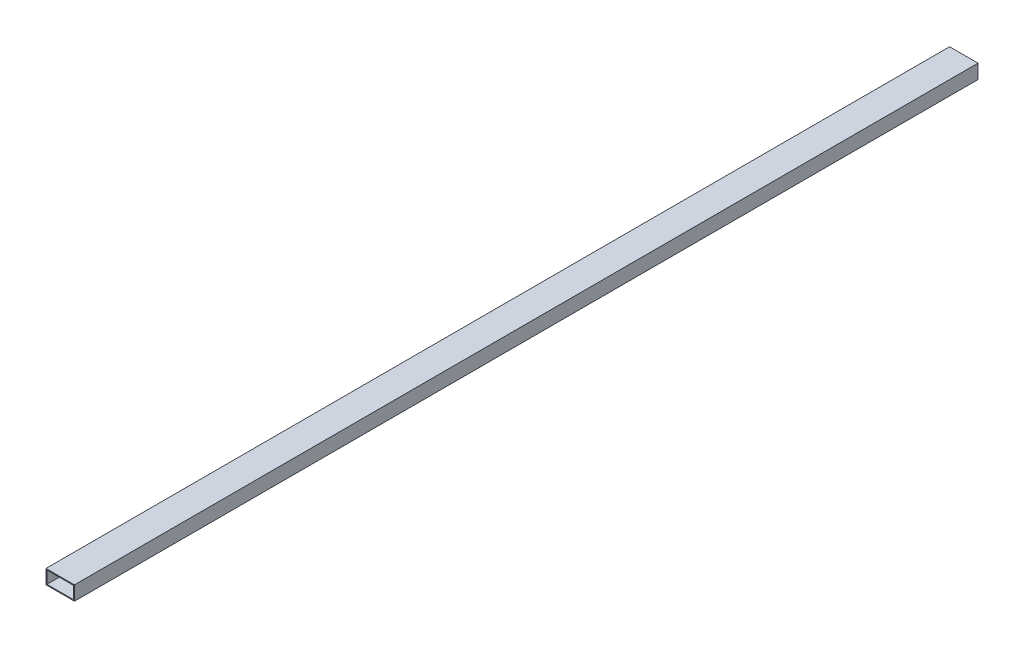
ISO-10303-21;
HEADER;
FILE_DESCRIPTION(('STEP AP214'),'2;1');
FILE_NAME('part.step','',(''),(''),'','','');
FILE_SCHEMA(('AUTOMOTIVE_DESIGN { 1 0 10303 214 1 1 1 1 }'));
ENDSEC;
DATA;
#1=APPLICATION_CONTEXT('core data for automotive mechanical design processes');
#2=APPLICATION_PROTOCOL_DEFINITION('international standard','automotive_design',2000,#1);
#3=PRODUCT_CONTEXT('',#1,'mechanical');
#4=PRODUCT('Part','Part','',(#3));
#5=PRODUCT_RELATED_PRODUCT_CATEGORY('part','',(#4));
#6=PRODUCT_DEFINITION_FORMATION('','',#4);
#7=PRODUCT_DEFINITION_CONTEXT('part definition',#1,'design');
#8=PRODUCT_DEFINITION('design','',#6,#7);
#9=PRODUCT_DEFINITION_SHAPE('','',#8);
#10=(LENGTH_UNIT() NAMED_UNIT(*) SI_UNIT(.MILLI.,.METRE.));
#11=(NAMED_UNIT(*) PLANE_ANGLE_UNIT() SI_UNIT($,.RADIAN.));
#12=(NAMED_UNIT(*) SI_UNIT($,.STERADIAN.) SOLID_ANGLE_UNIT());
#13=UNCERTAINTY_MEASURE_WITH_UNIT(LENGTH_MEASURE(1.E-05),#10,'distance_accuracy_value','');
#14=(GEOMETRIC_REPRESENTATION_CONTEXT(3) GLOBAL_UNCERTAINTY_ASSIGNED_CONTEXT((#13)) GLOBAL_UNIT_ASSIGNED_CONTEXT((#10,
#11,#12)) REPRESENTATION_CONTEXT('',''));
#15=CARTESIAN_POINT('',(0.,0.,0.));
#16=DIRECTION('',(0.,0.,1.));
#17=DIRECTION('',(1.,0.,0.));
#18=AXIS2_PLACEMENT_3D('',#15,#16,#17);
#19=CARTESIAN_POINT('',(0.,0.,953.));
#20=DIRECTION('',(0.,0.,-1.));
#21=DIRECTION('',(-1.,0.,0.));
#22=AXIS2_PLACEMENT_3D('',#19,#20,#21);
#23=PLANE('',#22);
#24=DIRECTION('',(0.,-1.,0.));
#25=VECTOR('',#24,1.);
#26=CARTESIAN_POINT('',(0.,0.,953.));
#27=LINE('',#26,#25);
#28=CARTESIAN_POINT('',(0.,15.,953.));
#29=VERTEX_POINT('',#28);
#30=CARTESIAN_POINT('',(0.,0.,953.));
#31=VERTEX_POINT('',#30);
#32=EDGE_CURVE('E136',#29,#31,#27,.T.);
#33=ORIENTED_EDGE('',*,*,#32,.T.);
#34=DIRECTION('',(1.,0.,0.));
#35=VECTOR('',#34,1.);
#36=CARTESIAN_POINT('',(0.,0.,953.));
#37=LINE('',#36,#35);
#38=CARTESIAN_POINT('',(30.,0.,953.));
#39=VERTEX_POINT('',#38);
#40=EDGE_CURVE('E139',#31,#39,#37,.T.);
#41=ORIENTED_EDGE('',*,*,#40,.T.);
#42=DIRECTION('',(0.,1.,0.));
#43=VECTOR('',#42,1.);
#44=CARTESIAN_POINT('',(30.,0.,953.));
#45=LINE('',#44,#43);
#46=CARTESIAN_POINT('',(30.,15.,953.));
#47=VERTEX_POINT('',#46);
#48=EDGE_CURVE('E142',#39,#47,#45,.T.);
#49=ORIENTED_EDGE('',*,*,#48,.T.);
#50=DIRECTION('',(-1.,0.,0.));
#51=VECTOR('',#50,1.);
#52=CARTESIAN_POINT('',(0.,15.,953.));
#53=LINE('',#52,#51);
#54=EDGE_CURVE('E144',#47,#29,#53,.T.);
#55=ORIENTED_EDGE('',*,*,#54,.T.);
#56=EDGE_LOOP('',(#33,#41,#49,#55));
#57=FACE_BOUND('',#56,.T.);
#58=DIRECTION('',(0.,-1.,0.));
#59=VECTOR('',#58,1.);
#60=CARTESIAN_POINT('',(1.,1.,953.));
#61=LINE('',#60,#59);
#62=CARTESIAN_POINT('',(1.,14.,953.));
#63=VERTEX_POINT('',#62);
#64=CARTESIAN_POINT('',(1.,1.,953.));
#65=VERTEX_POINT('',#64);
#66=EDGE_CURVE('E100',#63,#65,#61,.T.);
#67=ORIENTED_EDGE('',*,*,#66,.F.);
#68=DIRECTION('',(-1.,0.,0.));
#69=VECTOR('',#68,1.);
#70=CARTESIAN_POINT('',(1.,14.,953.));
#71=LINE('',#70,#69);
#72=CARTESIAN_POINT('',(29.,14.,953.));
#73=VERTEX_POINT('',#72);
#74=EDGE_CURVE('E122',#73,#63,#71,.T.);
#75=ORIENTED_EDGE('',*,*,#74,.F.);
#76=DIRECTION('',(0.,1.,0.));
#77=VECTOR('',#76,1.);
#78=CARTESIAN_POINT('',(29.,1.,953.));
#79=LINE('',#78,#77);
#80=CARTESIAN_POINT('',(29.,1.,953.));
#81=VERTEX_POINT('',#80);
#82=EDGE_CURVE('E120',#81,#73,#79,.T.);
#83=ORIENTED_EDGE('',*,*,#82,.F.);
#84=DIRECTION('',(1.,0.,0.));
#85=VECTOR('',#84,1.);
#86=CARTESIAN_POINT('',(1.,1.,953.));
#87=LINE('',#86,#85);
#88=EDGE_CURVE('E108',#65,#81,#87,.T.);
#89=ORIENTED_EDGE('',*,*,#88,.F.);
#90=EDGE_LOOP('',(#67,#75,#83,#89));
#91=FACE_BOUND('',#90,.T.);
#92=ADVANCED_FACE('F35',(#57,#91),#23,.F.);
#93=CARTESIAN_POINT('',(0.,0.,0.));
#94=DIRECTION('',(0.,0.,-1.));
#95=DIRECTION('',(-1.,0.,0.));
#96=AXIS2_PLACEMENT_3D('',#93,#94,#95);
#97=PLANE('',#96);
#98=DIRECTION('',(0.,-1.,0.));
#99=VECTOR('',#98,1.);
#100=CARTESIAN_POINT('',(0.,0.,0.));
#101=LINE('',#100,#99);
#102=CARTESIAN_POINT('',(0.,15.,0.));
#103=VERTEX_POINT('',#102);
#104=CARTESIAN_POINT('',(0.,0.,0.));
#105=VERTEX_POINT('',#104);
#106=EDGE_CURVE('E116',#103,#105,#101,.T.);
#107=ORIENTED_EDGE('',*,*,#106,.F.);
#108=DIRECTION('',(-1.,0.,0.));
#109=VECTOR('',#108,1.);
#110=CARTESIAN_POINT('',(0.,15.,0.));
#111=LINE('',#110,#109);
#112=CARTESIAN_POINT('',(30.,15.,0.));
#113=VERTEX_POINT('',#112);
#114=EDGE_CURVE('E140',#113,#103,#111,.T.);
#115=ORIENTED_EDGE('',*,*,#114,.F.);
#116=DIRECTION('',(0.,1.,0.));
#117=VECTOR('',#116,1.);
#118=CARTESIAN_POINT('',(30.,0.,0.));
#119=LINE('',#118,#117);
#120=CARTESIAN_POINT('',(30.,0.,0.));
#121=VERTEX_POINT('',#120);
#122=EDGE_CURVE('E151',#121,#113,#119,.T.);
#123=ORIENTED_EDGE('',*,*,#122,.F.);
#124=DIRECTION('',(1.,0.,0.));
#125=VECTOR('',#124,1.);
#126=CARTESIAN_POINT('',(0.,0.,0.));
#127=LINE('',#126,#125);
#128=EDGE_CURVE('E149',#105,#121,#127,.T.);
#129=ORIENTED_EDGE('',*,*,#128,.F.);
#130=EDGE_LOOP('',(#107,#115,#123,#129));
#131=FACE_BOUND('',#130,.T.);
#132=DIRECTION('',(-1.,0.,0.));
#133=VECTOR('',#132,1.);
#134=CARTESIAN_POINT('',(1.,14.,0.));
#135=LINE('',#134,#133);
#136=CARTESIAN_POINT('',(29.,14.,0.));
#137=VERTEX_POINT('',#136);
#138=CARTESIAN_POINT('',(1.,14.,0.));
#139=VERTEX_POINT('',#138);
#140=EDGE_CURVE('E109',#137,#139,#135,.T.);
#141=ORIENTED_EDGE('',*,*,#140,.T.);
#142=DIRECTION('',(0.,-1.,0.));
#143=VECTOR('',#142,1.);
#144=CARTESIAN_POINT('',(1.,1.,0.));
#145=LINE('',#144,#143);
#146=CARTESIAN_POINT('',(1.,1.,0.));
#147=VERTEX_POINT('',#146);
#148=EDGE_CURVE('E58',#139,#147,#145,.T.);
#149=ORIENTED_EDGE('',*,*,#148,.T.);
#150=DIRECTION('',(1.,0.,0.));
#151=VECTOR('',#150,1.);
#152=CARTESIAN_POINT('',(1.,1.,0.));
#153=LINE('',#152,#151);
#154=CARTESIAN_POINT('',(29.,1.,0.));
#155=VERTEX_POINT('',#154);
#156=EDGE_CURVE('E115',#147,#155,#153,.T.);
#157=ORIENTED_EDGE('',*,*,#156,.T.);
#158=DIRECTION('',(0.,1.,0.));
#159=VECTOR('',#158,1.);
#160=CARTESIAN_POINT('',(29.,1.,0.));
#161=LINE('',#160,#159);
#162=EDGE_CURVE('E128',#155,#137,#161,.T.);
#163=ORIENTED_EDGE('',*,*,#162,.T.);
#164=EDGE_LOOP('',(#141,#149,#157,#163));
#165=FACE_BOUND('',#164,.T.);
#166=ADVANCED_FACE('F169',(#131,#165),#97,.T.);
#167=CARTESIAN_POINT('',(0.,0.,953.));
#168=DIRECTION('',(1.,0.,0.));
#169=DIRECTION('',(0.,0.,-1.));
#170=AXIS2_PLACEMENT_3D('',#167,#168,#169);
#171=PLANE('',#170);
#172=ORIENTED_EDGE('',*,*,#106,.T.);
#173=DIRECTION('',(0.,0.,-1.));
#174=VECTOR('',#173,1.);
#175=CARTESIAN_POINT('',(0.,0.,953.));
#176=LINE('',#175,#174);
#177=EDGE_CURVE('E11',#31,#105,#176,.T.);
#178=ORIENTED_EDGE('',*,*,#177,.F.);
#179=ORIENTED_EDGE('',*,*,#32,.F.);
#180=DIRECTION('',(0.,0.,-1.));
#181=VECTOR('',#180,1.);
#182=CARTESIAN_POINT('',(0.,15.,953.));
#183=LINE('',#182,#181);
#184=EDGE_CURVE('E146',#29,#103,#183,.T.);
#185=ORIENTED_EDGE('',*,*,#184,.T.);
#186=EDGE_LOOP('',(#172,#178,#179,#185));
#187=FACE_BOUND('',#186,.T.);
#188=ADVANCED_FACE('F37',(#187),#171,.F.);
#189=CARTESIAN_POINT('',(0.,0.,953.));
#190=DIRECTION('',(0.,1.,0.));
#191=DIRECTION('',(0.,0.,1.));
#192=AXIS2_PLACEMENT_3D('',#189,#190,#191);
#193=PLANE('',#192);
#194=ORIENTED_EDGE('',*,*,#128,.T.);
#195=DIRECTION('',(0.,0.,-1.));
#196=VECTOR('',#195,1.);
#197=CARTESIAN_POINT('',(30.,0.,953.));
#198=LINE('',#197,#196);
#199=EDGE_CURVE('E43',#39,#121,#198,.T.);
#200=ORIENTED_EDGE('',*,*,#199,.F.);
#201=ORIENTED_EDGE('',*,*,#40,.F.);
#202=ORIENTED_EDGE('',*,*,#177,.T.);
#203=EDGE_LOOP('',(#194,#200,#201,#202));
#204=FACE_BOUND('',#203,.T.);
#205=ADVANCED_FACE('F179',(#204),#193,.F.);
#206=CARTESIAN_POINT('',(30.,0.,953.));
#207=DIRECTION('',(-1.,0.,0.));
#208=DIRECTION('',(0.,0.,1.));
#209=AXIS2_PLACEMENT_3D('',#206,#207,#208);
#210=PLANE('',#209);
#211=ORIENTED_EDGE('',*,*,#122,.T.);
#212=DIRECTION('',(0.,0.,-1.));
#213=VECTOR('',#212,1.);
#214=CARTESIAN_POINT('',(30.,15.,953.));
#215=LINE('',#214,#213);
#216=EDGE_CURVE('E156',#47,#113,#215,.T.);
#217=ORIENTED_EDGE('',*,*,#216,.F.);
#218=ORIENTED_EDGE('',*,*,#48,.F.);
#219=ORIENTED_EDGE('',*,*,#199,.T.);
#220=EDGE_LOOP('',(#211,#217,#218,#219));
#221=FACE_BOUND('',#220,.T.);
#222=ADVANCED_FACE('F163',(#221),#210,.F.);
#223=CARTESIAN_POINT('',(0.,15.,953.));
#224=DIRECTION('',(0.,-1.,0.));
#225=DIRECTION('',(0.,0.,-1.));
#226=AXIS2_PLACEMENT_3D('',#223,#224,#225);
#227=PLANE('',#226);
#228=ORIENTED_EDGE('',*,*,#114,.T.);
#229=ORIENTED_EDGE('',*,*,#184,.F.);
#230=ORIENTED_EDGE('',*,*,#54,.F.);
#231=ORIENTED_EDGE('',*,*,#216,.T.);
#232=EDGE_LOOP('',(#228,#229,#230,#231));
#233=FACE_BOUND('',#232,.T.);
#234=ADVANCED_FACE('F173',(#233),#227,.F.);
#235=CARTESIAN_POINT('',(1.,1.,953.));
#236=DIRECTION('',(1.,0.,0.));
#237=DIRECTION('',(0.,0.,-1.));
#238=AXIS2_PLACEMENT_3D('',#235,#236,#237);
#239=PLANE('',#238);
#240=ORIENTED_EDGE('',*,*,#148,.F.);
#241=DIRECTION('',(0.,0.,-1.));
#242=VECTOR('',#241,1.);
#243=CARTESIAN_POINT('',(1.,14.,953.));
#244=LINE('',#243,#242);
#245=EDGE_CURVE('E104',#63,#139,#244,.T.);
#246=ORIENTED_EDGE('',*,*,#245,.F.);
#247=ORIENTED_EDGE('',*,*,#66,.T.);
#248=DIRECTION('',(0.,0.,-1.));
#249=VECTOR('',#248,1.);
#250=CARTESIAN_POINT('',(1.,1.,953.));
#251=LINE('',#250,#249);
#252=EDGE_CURVE('E103',#65,#147,#251,.T.);
#253=ORIENTED_EDGE('',*,*,#252,.T.);
#254=EDGE_LOOP('',(#240,#246,#247,#253));
#255=FACE_BOUND('',#254,.T.);
#256=ADVANCED_FACE('F102',(#255),#239,.T.);
#257=CARTESIAN_POINT('',(1.,1.,953.));
#258=DIRECTION('',(0.,1.,0.));
#259=DIRECTION('',(0.,0.,1.));
#260=AXIS2_PLACEMENT_3D('',#257,#258,#259);
#261=PLANE('',#260);
#262=ORIENTED_EDGE('',*,*,#156,.F.);
#263=ORIENTED_EDGE('',*,*,#252,.F.);
#264=ORIENTED_EDGE('',*,*,#88,.T.);
#265=DIRECTION('',(0.,0.,-1.));
#266=VECTOR('',#265,1.);
#267=CARTESIAN_POINT('',(29.,1.,953.));
#268=LINE('',#267,#266);
#269=EDGE_CURVE('E117',#81,#155,#268,.T.);
#270=ORIENTED_EDGE('',*,*,#269,.T.);
#271=EDGE_LOOP('',(#262,#263,#264,#270));
#272=FACE_BOUND('',#271,.T.);
#273=ADVANCED_FACE('F112',(#272),#261,.T.);
#274=CARTESIAN_POINT('',(29.,1.,953.));
#275=DIRECTION('',(-1.,0.,0.));
#276=DIRECTION('',(0.,0.,1.));
#277=AXIS2_PLACEMENT_3D('',#274,#275,#276);
#278=PLANE('',#277);
#279=ORIENTED_EDGE('',*,*,#162,.F.);
#280=ORIENTED_EDGE('',*,*,#269,.F.);
#281=ORIENTED_EDGE('',*,*,#82,.T.);
#282=DIRECTION('',(0.,0.,-1.));
#283=VECTOR('',#282,1.);
#284=CARTESIAN_POINT('',(29.,14.,953.));
#285=LINE('',#284,#283);
#286=EDGE_CURVE('E50',#73,#137,#285,.T.);
#287=ORIENTED_EDGE('',*,*,#286,.T.);
#288=EDGE_LOOP('',(#279,#280,#281,#287));
#289=FACE_BOUND('',#288,.T.);
#290=ADVANCED_FACE('F202',(#289),#278,.T.);
#291=CARTESIAN_POINT('',(1.,14.,953.));
#292=DIRECTION('',(0.,-1.,0.));
#293=DIRECTION('',(0.,0.,-1.));
#294=AXIS2_PLACEMENT_3D('',#291,#292,#293);
#295=PLANE('',#294);
#296=ORIENTED_EDGE('',*,*,#140,.F.);
#297=ORIENTED_EDGE('',*,*,#286,.F.);
#298=ORIENTED_EDGE('',*,*,#74,.T.);
#299=ORIENTED_EDGE('',*,*,#245,.T.);
#300=EDGE_LOOP('',(#296,#297,#298,#299));
#301=FACE_BOUND('',#300,.T.);
#302=ADVANCED_FACE('F206',(#301),#295,.T.);
#303=CLOSED_SHELL('',(#92,#166,#188,#205,#222,#234,#256,#273,#290,#302));
#304=MANIFOLD_SOLID_BREP('B2',#303);
#305=ADVANCED_BREP_SHAPE_REPRESENTATION('',(#18,#304),#14);
#306=SHAPE_DEFINITION_REPRESENTATION(#9,#305);
ENDSEC;
END-ISO-10303-21;
